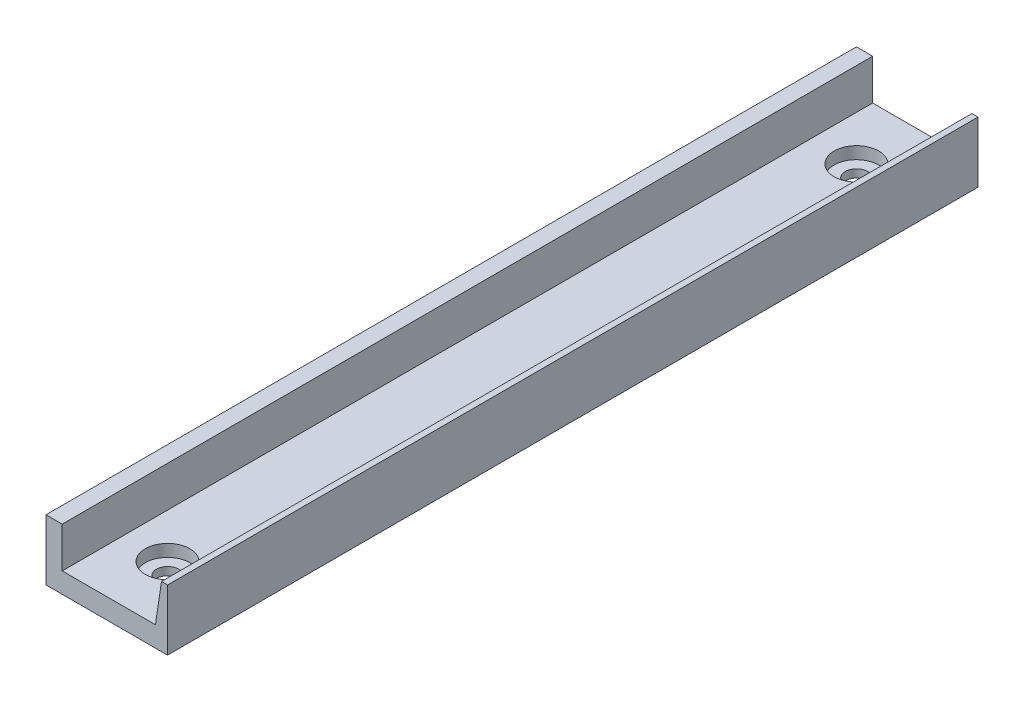
ISO-10303-21;
HEADER;
FILE_DESCRIPTION(('STEP AP214'),'2;1');
FILE_NAME('part.step','',(''),(''),'','','');
FILE_SCHEMA(('AUTOMOTIVE_DESIGN { 1 0 10303 214 1 1 1 1 }'));
ENDSEC;
DATA;
#1=APPLICATION_CONTEXT('core data for automotive mechanical design processes');
#2=APPLICATION_PROTOCOL_DEFINITION('international standard','automotive_design',2000,#1);
#3=PRODUCT_CONTEXT('',#1,'mechanical');
#4=PRODUCT('Part','Part','',(#3));
#5=PRODUCT_RELATED_PRODUCT_CATEGORY('part','',(#4));
#6=PRODUCT_DEFINITION_FORMATION('','',#4);
#7=PRODUCT_DEFINITION_CONTEXT('part definition',#1,'design');
#8=PRODUCT_DEFINITION('design','',#6,#7);
#9=PRODUCT_DEFINITION_SHAPE('','',#8);
#10=(LENGTH_UNIT() NAMED_UNIT(*) SI_UNIT(.MILLI.,.METRE.));
#11=(NAMED_UNIT(*) PLANE_ANGLE_UNIT() SI_UNIT($,.RADIAN.));
#12=(NAMED_UNIT(*) SI_UNIT($,.STERADIAN.) SOLID_ANGLE_UNIT());
#13=UNCERTAINTY_MEASURE_WITH_UNIT(LENGTH_MEASURE(1.E-05),#10,'distance_accuracy_value','');
#14=(GEOMETRIC_REPRESENTATION_CONTEXT(3) GLOBAL_UNCERTAINTY_ASSIGNED_CONTEXT((#13)) GLOBAL_UNIT_ASSIGNED_CONTEXT((#10,
#11,#12)) REPRESENTATION_CONTEXT('',''));
#15=CARTESIAN_POINT('',(0.,0.,0.));
#16=DIRECTION('',(0.,0.,1.));
#17=DIRECTION('',(1.,0.,0.));
#18=AXIS2_PLACEMENT_3D('',#15,#16,#17);
#19=CARTESIAN_POINT('',(0.,0.,0.));
#20=DIRECTION('',(0.,1.,0.));
#21=DIRECTION('',(0.,0.,1.));
#22=AXIS2_PLACEMENT_3D('',#19,#20,#21);
#23=PLANE('',#22);
#24=DIRECTION('',(0.,0.,-1.));
#25=VECTOR('',#24,1.);
#26=CARTESIAN_POINT('',(15.,0.,-100.));
#27=LINE('',#26,#25);
#28=CARTESIAN_POINT('',(15.,0.,100.));
#29=VERTEX_POINT('',#28);
#30=CARTESIAN_POINT('',(15.,0.,-100.));
#31=VERTEX_POINT('',#30);
#32=EDGE_CURVE('E242',#29,#31,#27,.T.);
#33=ORIENTED_EDGE('',*,*,#32,.F.);
#34=DIRECTION('',(1.,0.,0.));
#35=VECTOR('',#34,1.);
#36=CARTESIAN_POINT('',(-15.,0.,100.));
#37=LINE('',#36,#35);
#38=CARTESIAN_POINT('',(-15.,0.,100.));
#39=VERTEX_POINT('',#38);
#40=EDGE_CURVE('E247',#39,#29,#37,.T.);
#41=ORIENTED_EDGE('',*,*,#40,.F.);
#42=DIRECTION('',(0.,0.,1.));
#43=VECTOR('',#42,1.);
#44=CARTESIAN_POINT('',(-15.,0.,-100.));
#45=LINE('',#44,#43);
#46=CARTESIAN_POINT('',(-15.,0.,-100.));
#47=VERTEX_POINT('',#46);
#48=EDGE_CURVE('E258',#47,#39,#45,.T.);
#49=ORIENTED_EDGE('',*,*,#48,.F.);
#50=DIRECTION('',(-1.,0.,0.));
#51=VECTOR('',#50,1.);
#52=CARTESIAN_POINT('',(-15.,0.,-100.));
#53=LINE('',#52,#51);
#54=EDGE_CURVE('E255',#31,#47,#53,.T.);
#55=ORIENTED_EDGE('',*,*,#54,.F.);
#56=EDGE_LOOP('',(#33,#41,#49,#55));
#57=FACE_BOUND('',#56,.T.);
#58=CARTESIAN_POINT('',(0.,0.,85.));
#59=DIRECTION('',(0.,1.,0.));
#60=DIRECTION('',(0.,0.,1.));
#61=AXIS2_PLACEMENT_3D('',#58,#59,#60);
#62=CIRCLE('',#61,2.74999999999999);
#63=CARTESIAN_POINT('',(0.,0.,87.75));
#64=VERTEX_POINT('',#63);
#65=EDGE_CURVE('E190',#64,#64,#62,.T.);
#66=ORIENTED_EDGE('',*,*,#65,.T.);
#67=EDGE_LOOP('',(#66));
#68=FACE_BOUND('',#67,.T.);
#69=CARTESIAN_POINT('',(0.,0.,-85.));
#70=DIRECTION('',(0.,1.,0.));
#71=DIRECTION('',(0.,0.,1.));
#72=AXIS2_PLACEMENT_3D('',#69,#70,#71);
#73=CIRCLE('',#72,2.74999999999999);
#74=CARTESIAN_POINT('',(0.,0.,-82.25));
#75=VERTEX_POINT('',#74);
#76=EDGE_CURVE('E48',#75,#75,#73,.T.);
#77=ORIENTED_EDGE('',*,*,#76,.T.);
#78=EDGE_LOOP('',(#77));
#79=FACE_BOUND('',#78,.T.);
#80=DIRECTION('',(0.,0.,1.));
#81=VECTOR('',#80,1.);
#82=CARTESIAN_POINT('',(3.04999999999999,0.,60.));
#83=LINE('',#82,#81);
#84=CARTESIAN_POINT('',(3.05000000000001,0.,-60.));
#85=VERTEX_POINT('',#84);
#86=CARTESIAN_POINT('',(3.04999999999999,0.,60.));
#87=VERTEX_POINT('',#86);
#88=EDGE_CURVE('E158',#85,#87,#83,.T.);
#89=ORIENTED_EDGE('',*,*,#88,.F.);
#90=DIRECTION('',(1.,0.,0.));
#91=VECTOR('',#90,1.);
#92=CARTESIAN_POINT('',(-3.04999999999999,0.,-60.));
#93=LINE('',#92,#91);
#94=CARTESIAN_POINT('',(-3.04999999999999,0.,-60.));
#95=VERTEX_POINT('',#94);
#96=EDGE_CURVE('E155',#95,#85,#93,.T.);
#97=ORIENTED_EDGE('',*,*,#96,.F.);
#98=DIRECTION('',(0.,0.,-1.));
#99=VECTOR('',#98,1.);
#100=CARTESIAN_POINT('',(-3.05000000000001,0.,60.));
#101=LINE('',#100,#99);
#102=CARTESIAN_POINT('',(-3.05000000000001,0.,60.));
#103=VERTEX_POINT('',#102);
#104=EDGE_CURVE('E67',#103,#95,#101,.T.);
#105=ORIENTED_EDGE('',*,*,#104,.F.);
#106=DIRECTION('',(-1.,0.,0.));
#107=VECTOR('',#106,1.);
#108=CARTESIAN_POINT('',(-3.05000000000001,0.,60.));
#109=LINE('',#108,#107);
#110=EDGE_CURVE('E62',#87,#103,#109,.T.);
#111=ORIENTED_EDGE('',*,*,#110,.F.);
#112=EDGE_LOOP('',(#89,#97,#105,#111));
#113=FACE_BOUND('',#112,.T.);
#114=ADVANCED_FACE('F44',(#57,#68,#79,#113),#23,.F.);
#115=CARTESIAN_POINT('',(0.,5.,0.));
#116=DIRECTION('',(0.,1.,0.));
#117=DIRECTION('',(0.,0.,1.));
#118=AXIS2_PLACEMENT_3D('',#115,#116,#117);
#119=PLANE('',#118);
#120=CARTESIAN_POINT('',(0.,5.,-85.));
#121=DIRECTION('',(0.,1.,0.));
#122=DIRECTION('',(0.,0.,1.));
#123=AXIS2_PLACEMENT_3D('',#120,#121,#122);
#124=CIRCLE('',#123,5.5);
#125=CARTESIAN_POINT('',(0.,5.,-79.5));
#126=VERTEX_POINT('',#125);
#127=EDGE_CURVE('E160',#126,#126,#124,.T.);
#128=ORIENTED_EDGE('',*,*,#127,.F.);
#129=EDGE_LOOP('',(#128));
#130=FACE_BOUND('',#129,.T.);
#131=CARTESIAN_POINT('',(0.,5.,85.));
#132=DIRECTION('',(0.,1.,0.));
#133=DIRECTION('',(0.,0.,1.));
#134=AXIS2_PLACEMENT_3D('',#131,#132,#133);
#135=CIRCLE('',#134,5.5);
#136=CARTESIAN_POINT('',(0.,5.,90.5));
#137=VERTEX_POINT('',#136);
#138=EDGE_CURVE('E178',#137,#137,#135,.T.);
#139=ORIENTED_EDGE('',*,*,#138,.F.);
#140=EDGE_LOOP('',(#139));
#141=FACE_BOUND('',#140,.T.);
#142=DIRECTION('',(1.,0.,0.));
#143=VECTOR('',#142,1.);
#144=CARTESIAN_POINT('',(-15.,5.,100.));
#145=LINE('',#144,#143);
#146=CARTESIAN_POINT('',(-11.,5.,100.));
#147=VERTEX_POINT('',#146);
#148=CARTESIAN_POINT('',(12.,5.,100.));
#149=VERTEX_POINT('',#148);
#150=EDGE_CURVE('E246',#147,#149,#145,.T.);
#151=ORIENTED_EDGE('',*,*,#150,.T.);
#152=DIRECTION('',(0.,0.,1.));
#153=VECTOR('',#152,1.);
#154=CARTESIAN_POINT('',(12.,5.,-100.));
#155=LINE('',#154,#153);
#156=CARTESIAN_POINT('',(12.,5.,-100.));
#157=VERTEX_POINT('',#156);
#158=EDGE_CURVE('E203',#157,#149,#155,.T.);
#159=ORIENTED_EDGE('',*,*,#158,.F.);
#160=DIRECTION('',(-1.,0.,0.));
#161=VECTOR('',#160,1.);
#162=CARTESIAN_POINT('',(-15.,5.,-100.));
#163=LINE('',#162,#161);
#164=CARTESIAN_POINT('',(-11.,5.,-100.));
#165=VERTEX_POINT('',#164);
#166=EDGE_CURVE('E243',#157,#165,#163,.T.);
#167=ORIENTED_EDGE('',*,*,#166,.T.);
#168=DIRECTION('',(0.,0.,-1.));
#169=VECTOR('',#168,1.);
#170=CARTESIAN_POINT('',(-11.,5.,-100.));
#171=LINE('',#170,#169);
#172=EDGE_CURVE('E206',#147,#165,#171,.T.);
#173=ORIENTED_EDGE('',*,*,#172,.F.);
#174=EDGE_LOOP('',(#151,#159,#167,#173));
#175=FACE_BOUND('',#174,.T.);
#176=ADVANCED_FACE('F295',(#130,#141,#175),#119,.T.);
#177=CARTESIAN_POINT('',(15.,5.,-100.));
#178=DIRECTION('',(-1.,0.,0.));
#179=DIRECTION('',(0.,0.,1.));
#180=AXIS2_PLACEMENT_3D('',#177,#178,#179);
#181=PLANE('',#180);
#182=ORIENTED_EDGE('',*,*,#32,.T.);
#183=DIRECTION('',(0.,-1.,0.));
#184=VECTOR('',#183,1.);
#185=CARTESIAN_POINT('',(15.,5.,-100.));
#186=LINE('',#185,#184);
#187=CARTESIAN_POINT('',(15.,15.,-100.));
#188=VERTEX_POINT('',#187);
#189=EDGE_CURVE('E11',#188,#31,#186,.T.);
#190=ORIENTED_EDGE('',*,*,#189,.F.);
#191=DIRECTION('',(0.,0.,-1.));
#192=VECTOR('',#191,1.);
#193=CARTESIAN_POINT('',(15.,15.,-100.));
#194=LINE('',#193,#192);
#195=CARTESIAN_POINT('',(15.,15.,100.));
#196=VERTEX_POINT('',#195);
#197=EDGE_CURVE('E207',#196,#188,#194,.T.);
#198=ORIENTED_EDGE('',*,*,#197,.F.);
#199=DIRECTION('',(0.,-1.,0.));
#200=VECTOR('',#199,1.);
#201=CARTESIAN_POINT('',(15.,5.,100.));
#202=LINE('',#201,#200);
#203=EDGE_CURVE('E251',#196,#29,#202,.T.);
#204=ORIENTED_EDGE('',*,*,#203,.T.);
#205=EDGE_LOOP('',(#182,#190,#198,#204));
#206=FACE_BOUND('',#205,.T.);
#207=ADVANCED_FACE('F46',(#206),#181,.F.);
#208=CARTESIAN_POINT('',(-15.,5.,-100.));
#209=DIRECTION('',(0.,0.,1.));
#210=DIRECTION('',(1.,0.,0.));
#211=AXIS2_PLACEMENT_3D('',#208,#209,#210);
#212=PLANE('',#211);
#213=ORIENTED_EDGE('',*,*,#166,.F.);
#214=DIRECTION('',(0.148340452930243,0.988936352868298,0.));
#215=VECTOR('',#214,1.);
#216=CARTESIAN_POINT('',(13.5,15.,-100.));
#217=LINE('',#216,#215);
#218=CARTESIAN_POINT('',(13.5,15.,-100.));
#219=VERTEX_POINT('',#218);
#220=EDGE_CURVE('E191',#157,#219,#217,.T.);
#221=ORIENTED_EDGE('',*,*,#220,.T.);
#222=DIRECTION('',(-1.,0.,0.));
#223=VECTOR('',#222,1.);
#224=CARTESIAN_POINT('',(15.,15.,-100.));
#225=LINE('',#224,#223);
#226=EDGE_CURVE('E210',#188,#219,#225,.T.);
#227=ORIENTED_EDGE('',*,*,#226,.F.);
#228=ORIENTED_EDGE('',*,*,#189,.T.);
#229=ORIENTED_EDGE('',*,*,#54,.T.);
#230=DIRECTION('',(0.,-1.,0.));
#231=VECTOR('',#230,1.);
#232=CARTESIAN_POINT('',(-15.,5.,-100.));
#233=LINE('',#232,#231);
#234=CARTESIAN_POINT('',(-15.,15.,-100.));
#235=VERTEX_POINT('',#234);
#236=EDGE_CURVE('E54',#235,#47,#233,.T.);
#237=ORIENTED_EDGE('',*,*,#236,.F.);
#238=DIRECTION('',(-1.,0.,0.));
#239=VECTOR('',#238,1.);
#240=CARTESIAN_POINT('',(-15.,15.,-100.));
#241=LINE('',#240,#239);
#242=CARTESIAN_POINT('',(-11.,15.,-100.));
#243=VERTEX_POINT('',#242);
#244=EDGE_CURVE('E227',#243,#235,#241,.T.);
#245=ORIENTED_EDGE('',*,*,#244,.F.);
#246=DIRECTION('',(0.,-1.,0.));
#247=VECTOR('',#246,1.);
#248=CARTESIAN_POINT('',(-11.,15.,-100.));
#249=LINE('',#248,#247);
#250=EDGE_CURVE('E231',#243,#165,#249,.T.);
#251=ORIENTED_EDGE('',*,*,#250,.T.);
#252=EDGE_LOOP('',(#213,#221,#227,#228,#229,#237,#245,#251));
#253=FACE_BOUND('',#252,.T.);
#254=ADVANCED_FACE('F313',(#253),#212,.F.);
#255=CARTESIAN_POINT('',(-15.,5.,-100.));
#256=DIRECTION('',(1.,0.,0.));
#257=DIRECTION('',(0.,0.,-1.));
#258=AXIS2_PLACEMENT_3D('',#255,#256,#257);
#259=PLANE('',#258);
#260=ORIENTED_EDGE('',*,*,#48,.T.);
#261=DIRECTION('',(0.,-1.,0.));
#262=VECTOR('',#261,1.);
#263=CARTESIAN_POINT('',(-15.,5.,100.));
#264=LINE('',#263,#262);
#265=CARTESIAN_POINT('',(-15.,15.,100.));
#266=VERTEX_POINT('',#265);
#267=EDGE_CURVE('E266',#266,#39,#264,.T.);
#268=ORIENTED_EDGE('',*,*,#267,.F.);
#269=DIRECTION('',(0.,0.,1.));
#270=VECTOR('',#269,1.);
#271=CARTESIAN_POINT('',(-15.,15.,-100.));
#272=LINE('',#271,#270);
#273=EDGE_CURVE('E217',#235,#266,#272,.T.);
#274=ORIENTED_EDGE('',*,*,#273,.F.);
#275=ORIENTED_EDGE('',*,*,#236,.T.);
#276=EDGE_LOOP('',(#260,#268,#274,#275));
#277=FACE_BOUND('',#276,.T.);
#278=ADVANCED_FACE('F310',(#277),#259,.F.);
#279=CARTESIAN_POINT('',(-15.,5.,100.));
#280=DIRECTION('',(0.,0.,-1.));
#281=DIRECTION('',(-1.,0.,0.));
#282=AXIS2_PLACEMENT_3D('',#279,#280,#281);
#283=PLANE('',#282);
#284=DIRECTION('',(1.,0.,0.));
#285=VECTOR('',#284,1.);
#286=CARTESIAN_POINT('',(15.,15.,100.));
#287=LINE('',#286,#285);
#288=CARTESIAN_POINT('',(13.5,15.,100.));
#289=VERTEX_POINT('',#288);
#290=EDGE_CURVE('E202',#289,#196,#287,.T.);
#291=ORIENTED_EDGE('',*,*,#290,.F.);
#292=DIRECTION('',(0.148340452930243,0.988936352868298,0.));
#293=VECTOR('',#292,1.);
#294=CARTESIAN_POINT('',(13.5,15.,100.));
#295=LINE('',#294,#293);
#296=EDGE_CURVE('E196',#149,#289,#295,.T.);
#297=ORIENTED_EDGE('',*,*,#296,.F.);
#298=ORIENTED_EDGE('',*,*,#150,.F.);
#299=DIRECTION('',(0.,-1.,0.));
#300=VECTOR('',#299,1.);
#301=CARTESIAN_POINT('',(-11.,15.,100.));
#302=LINE('',#301,#300);
#303=CARTESIAN_POINT('',(-11.,15.,100.));
#304=VERTEX_POINT('',#303);
#305=EDGE_CURVE('E238',#304,#147,#302,.T.);
#306=ORIENTED_EDGE('',*,*,#305,.F.);
#307=DIRECTION('',(1.,0.,0.));
#308=VECTOR('',#307,1.);
#309=CARTESIAN_POINT('',(-15.,15.,100.));
#310=LINE('',#309,#308);
#311=EDGE_CURVE('E221',#266,#304,#310,.T.);
#312=ORIENTED_EDGE('',*,*,#311,.F.);
#313=ORIENTED_EDGE('',*,*,#267,.T.);
#314=ORIENTED_EDGE('',*,*,#40,.T.);
#315=ORIENTED_EDGE('',*,*,#203,.F.);
#316=EDGE_LOOP('',(#291,#297,#298,#306,#312,#313,#314,#315));
#317=FACE_BOUND('',#316,.T.);
#318=ADVANCED_FACE('F306',(#317),#283,.F.);
#319=CARTESIAN_POINT('',(-11.,15.,-100.));
#320=DIRECTION('',(-1.,0.,0.));
#321=DIRECTION('',(0.,0.,1.));
#322=AXIS2_PLACEMENT_3D('',#319,#320,#321);
#323=PLANE('',#322);
#324=ORIENTED_EDGE('',*,*,#172,.T.);
#325=ORIENTED_EDGE('',*,*,#250,.F.);
#326=DIRECTION('',(0.,0.,-1.));
#327=VECTOR('',#326,1.);
#328=CARTESIAN_POINT('',(-11.,15.,-100.));
#329=LINE('',#328,#327);
#330=EDGE_CURVE('E224',#304,#243,#329,.T.);
#331=ORIENTED_EDGE('',*,*,#330,.F.);
#332=ORIENTED_EDGE('',*,*,#305,.T.);
#333=EDGE_LOOP('',(#324,#325,#331,#332));
#334=FACE_BOUND('',#333,.T.);
#335=ADVANCED_FACE('F309',(#334),#323,.F.);
#336=CARTESIAN_POINT('',(0.,15.,0.));
#337=DIRECTION('',(0.,1.,0.));
#338=DIRECTION('',(0.,0.,1.));
#339=AXIS2_PLACEMENT_3D('',#336,#337,#338);
#340=PLANE('',#339);
#341=ORIENTED_EDGE('',*,*,#273,.T.);
#342=ORIENTED_EDGE('',*,*,#311,.T.);
#343=ORIENTED_EDGE('',*,*,#330,.T.);
#344=ORIENTED_EDGE('',*,*,#244,.T.);
#345=EDGE_LOOP('',(#341,#342,#343,#344));
#346=FACE_BOUND('',#345,.T.);
#347=ADVANCED_FACE('F341',(#346),#340,.T.);
#348=CARTESIAN_POINT('',(0.,15.,0.));
#349=DIRECTION('',(0.,-1.,0.));
#350=DIRECTION('',(0.,0.,-1.));
#351=AXIS2_PLACEMENT_3D('',#348,#349,#350);
#352=PLANE('',#351);
#353=ORIENTED_EDGE('',*,*,#226,.T.);
#354=DIRECTION('',(0.,0.,1.));
#355=VECTOR('',#354,1.);
#356=CARTESIAN_POINT('',(13.5,15.,-100.));
#357=LINE('',#356,#355);
#358=EDGE_CURVE('E195',#219,#289,#357,.T.);
#359=ORIENTED_EDGE('',*,*,#358,.T.);
#360=ORIENTED_EDGE('',*,*,#290,.T.);
#361=ORIENTED_EDGE('',*,*,#197,.T.);
#362=EDGE_LOOP('',(#353,#359,#360,#361));
#363=FACE_BOUND('',#362,.T.);
#364=ADVANCED_FACE('F291',(#363),#352,.F.);
#365=CARTESIAN_POINT('',(13.5,15.,-100.));
#366=DIRECTION('',(0.988936352868298,-0.148340452930243,0.));
#367=DIRECTION('',(0.148340452930243,0.988936352868298,0.));
#368=AXIS2_PLACEMENT_3D('',#365,#366,#367);
#369=PLANE('',#368);
#370=ORIENTED_EDGE('',*,*,#296,.T.);
#371=ORIENTED_EDGE('',*,*,#358,.F.);
#372=ORIENTED_EDGE('',*,*,#220,.F.);
#373=ORIENTED_EDGE('',*,*,#158,.T.);
#374=EDGE_LOOP('',(#370,#371,#372,#373));
#375=FACE_BOUND('',#374,.T.);
#376=ADVANCED_FACE('F281',(#375),#369,.F.);
#377=CARTESIAN_POINT('',(0.,5.,85.));
#378=DIRECTION('',(0.,1.,0.));
#379=DIRECTION('',(0.,0.,1.));
#380=AXIS2_PLACEMENT_3D('',#377,#378,#379);
#381=CYLINDRICAL_SURFACE('',#380,2.74999999999999);
#382=CARTESIAN_POINT('',(0.,2.,85.));
#383=DIRECTION('',(0.,1.,0.));
#384=DIRECTION('',(0.,0.,1.));
#385=AXIS2_PLACEMENT_3D('',#382,#383,#384);
#386=CIRCLE('',#385,2.75);
#387=CARTESIAN_POINT('',(0.,2.,87.75));
#388=VERTEX_POINT('',#387);
#389=EDGE_CURVE('E186',#388,#388,#386,.T.);
#390=ORIENTED_EDGE('',*,*,#389,.T.);
#391=EDGE_LOOP('',(#390));
#392=FACE_BOUND('',#391,.T.);
#393=ORIENTED_EDGE('',*,*,#65,.F.);
#394=EDGE_LOOP('',(#393));
#395=FACE_BOUND('',#394,.T.);
#396=ADVANCED_FACE('F278',(#392,#395),#381,.F.);
#397=CARTESIAN_POINT('',(2.74999999999998,2.,85.));
#398=DIRECTION('',(0.,-1.,0.));
#399=DIRECTION('',(0.,0.,-1.));
#400=AXIS2_PLACEMENT_3D('',#397,#398,#399);
#401=PLANE('',#400);
#402=ORIENTED_EDGE('',*,*,#389,.F.);
#403=EDGE_LOOP('',(#402));
#404=FACE_BOUND('',#403,.T.);
#405=CARTESIAN_POINT('',(0.,2.,85.));
#406=DIRECTION('',(0.,1.,0.));
#407=DIRECTION('',(0.,0.,1.));
#408=AXIS2_PLACEMENT_3D('',#405,#406,#407);
#409=CIRCLE('',#408,5.5);
#410=CARTESIAN_POINT('',(0.,2.,90.5));
#411=VERTEX_POINT('',#410);
#412=EDGE_CURVE('E182',#411,#411,#409,.T.);
#413=ORIENTED_EDGE('',*,*,#412,.T.);
#414=EDGE_LOOP('',(#413));
#415=FACE_BOUND('',#414,.T.);
#416=ADVANCED_FACE('F280',(#404,#415),#401,.F.);
#417=CARTESIAN_POINT('',(0.,5.,85.));
#418=DIRECTION('',(0.,1.,0.));
#419=DIRECTION('',(0.,0.,1.));
#420=AXIS2_PLACEMENT_3D('',#417,#418,#419);
#421=CYLINDRICAL_SURFACE('',#420,5.5);
#422=ORIENTED_EDGE('',*,*,#412,.F.);
#423=EDGE_LOOP('',(#422));
#424=FACE_BOUND('',#423,.T.);
#425=ORIENTED_EDGE('',*,*,#138,.T.);
#426=EDGE_LOOP('',(#425));
#427=FACE_BOUND('',#426,.T.);
#428=ADVANCED_FACE('F288',(#424,#427),#421,.F.);
#429=CARTESIAN_POINT('',(0.,5.,-85.));
#430=DIRECTION('',(0.,1.,0.));
#431=DIRECTION('',(0.,0.,1.));
#432=AXIS2_PLACEMENT_3D('',#429,#430,#431);
#433=CYLINDRICAL_SURFACE('',#432,2.74999999999999);
#434=CARTESIAN_POINT('',(0.,2.,-85.));
#435=DIRECTION('',(0.,1.,0.));
#436=DIRECTION('',(0.,0.,1.));
#437=AXIS2_PLACEMENT_3D('',#434,#435,#436);
#438=CIRCLE('',#437,2.75);
#439=CARTESIAN_POINT('',(0.,2.,-82.25));
#440=VERTEX_POINT('',#439);
#441=EDGE_CURVE('E174',#440,#440,#438,.T.);
#442=ORIENTED_EDGE('',*,*,#441,.T.);
#443=EDGE_LOOP('',(#442));
#444=FACE_BOUND('',#443,.T.);
#445=ORIENTED_EDGE('',*,*,#76,.F.);
#446=EDGE_LOOP('',(#445));
#447=FACE_BOUND('',#446,.T.);
#448=ADVANCED_FACE('F403',(#444,#447),#433,.F.);
#449=CARTESIAN_POINT('',(2.74999999999998,2.,-85.));
#450=DIRECTION('',(0.,-1.,0.));
#451=DIRECTION('',(0.,0.,-1.));
#452=AXIS2_PLACEMENT_3D('',#449,#450,#451);
#453=PLANE('',#452);
#454=ORIENTED_EDGE('',*,*,#441,.F.);
#455=EDGE_LOOP('',(#454));
#456=FACE_BOUND('',#455,.T.);
#457=CARTESIAN_POINT('',(0.,2.,-85.));
#458=DIRECTION('',(0.,1.,0.));
#459=DIRECTION('',(0.,0.,1.));
#460=AXIS2_PLACEMENT_3D('',#457,#458,#459);
#461=CIRCLE('',#460,5.5);
#462=CARTESIAN_POINT('',(0.,2.,-79.5));
#463=VERTEX_POINT('',#462);
#464=EDGE_CURVE('E165',#463,#463,#461,.T.);
#465=ORIENTED_EDGE('',*,*,#464,.T.);
#466=EDGE_LOOP('',(#465));
#467=FACE_BOUND('',#466,.T.);
#468=ADVANCED_FACE('F414',(#456,#467),#453,.F.);
#469=CARTESIAN_POINT('',(0.,5.,-85.));
#470=DIRECTION('',(0.,1.,0.));
#471=DIRECTION('',(0.,0.,1.));
#472=AXIS2_PLACEMENT_3D('',#469,#470,#471);
#473=CYLINDRICAL_SURFACE('',#472,5.5);
#474=ORIENTED_EDGE('',*,*,#464,.F.);
#475=EDGE_LOOP('',(#474));
#476=FACE_BOUND('',#475,.T.);
#477=ORIENTED_EDGE('',*,*,#127,.T.);
#478=EDGE_LOOP('',(#477));
#479=FACE_BOUND('',#478,.T.);
#480=ADVANCED_FACE('F425',(#476,#479),#473,.F.);
#481=CARTESIAN_POINT('',(3.04999999999999,-6.,60.));
#482=DIRECTION('',(-1.,0.,0.));
#483=DIRECTION('',(0.,0.,1.));
#484=AXIS2_PLACEMENT_3D('',#481,#482,#483);
#485=PLANE('',#484);
#486=ORIENTED_EDGE('',*,*,#88,.T.);
#487=DIRECTION('',(0.,1.,0.));
#488=VECTOR('',#487,1.);
#489=CARTESIAN_POINT('',(3.04999999999999,-6.,60.));
#490=LINE('',#489,#488);
#491=CARTESIAN_POINT('',(3.04999999999999,-6.,60.));
#492=VERTEX_POINT('',#491);
#493=EDGE_CURVE('E137',#492,#87,#490,.T.);
#494=ORIENTED_EDGE('',*,*,#493,.F.);
#495=DIRECTION('',(0.,0.,1.));
#496=VECTOR('',#495,1.);
#497=CARTESIAN_POINT('',(3.04999999999999,-6.,60.));
#498=LINE('',#497,#496);
#499=CARTESIAN_POINT('',(3.05000000000001,-6.,-60.));
#500=VERTEX_POINT('',#499);
#501=EDGE_CURVE('E145',#500,#492,#498,.T.);
#502=ORIENTED_EDGE('',*,*,#501,.F.);
#503=DIRECTION('',(0.,1.,0.));
#504=VECTOR('',#503,1.);
#505=CARTESIAN_POINT('',(3.05000000000001,-6.,-60.));
#506=LINE('',#505,#504);
#507=EDGE_CURVE('E501',#500,#85,#506,.T.);
#508=ORIENTED_EDGE('',*,*,#507,.T.);
#509=EDGE_LOOP('',(#486,#494,#502,#508));
#510=FACE_BOUND('',#509,.T.);
#511=ADVANCED_FACE('F157',(#510),#485,.F.);
#512=CARTESIAN_POINT('',(-3.05000000000001,-6.,60.));
#513=DIRECTION('',(0.,0.,-1.));
#514=DIRECTION('',(-1.,0.,0.));
#515=AXIS2_PLACEMENT_3D('',#512,#513,#514);
#516=PLANE('',#515);
#517=ORIENTED_EDGE('',*,*,#110,.T.);
#518=DIRECTION('',(0.,1.,0.));
#519=VECTOR('',#518,1.);
#520=CARTESIAN_POINT('',(-3.05000000000001,-6.,60.));
#521=LINE('',#520,#519);
#522=CARTESIAN_POINT('',(-3.05000000000001,-6.,60.));
#523=VERTEX_POINT('',#522);
#524=EDGE_CURVE('E140',#523,#103,#521,.T.);
#525=ORIENTED_EDGE('',*,*,#524,.F.);
#526=DIRECTION('',(-1.,0.,0.));
#527=VECTOR('',#526,1.);
#528=CARTESIAN_POINT('',(-3.05000000000001,-6.,60.));
#529=LINE('',#528,#527);
#530=EDGE_CURVE('E133',#492,#523,#529,.T.);
#531=ORIENTED_EDGE('',*,*,#530,.F.);
#532=ORIENTED_EDGE('',*,*,#493,.T.);
#533=EDGE_LOOP('',(#517,#525,#531,#532));
#534=FACE_BOUND('',#533,.T.);
#535=ADVANCED_FACE('F135',(#534),#516,.F.);
#536=CARTESIAN_POINT('',(-3.05000000000001,-6.,60.));
#537=DIRECTION('',(1.,0.,0.));
#538=DIRECTION('',(0.,0.,-1.));
#539=AXIS2_PLACEMENT_3D('',#536,#537,#538);
#540=PLANE('',#539);
#541=ORIENTED_EDGE('',*,*,#104,.T.);
#542=DIRECTION('',(0.,1.,0.));
#543=VECTOR('',#542,1.);
#544=CARTESIAN_POINT('',(-3.04999999999999,-6.,-60.));
#545=LINE('',#544,#543);
#546=CARTESIAN_POINT('',(-3.04999999999999,-6.,-60.));
#547=VERTEX_POINT('',#546);
#548=EDGE_CURVE('E167',#547,#95,#545,.T.);
#549=ORIENTED_EDGE('',*,*,#548,.F.);
#550=DIRECTION('',(0.,0.,-1.));
#551=VECTOR('',#550,1.);
#552=CARTESIAN_POINT('',(-3.05000000000001,-6.,60.));
#553=LINE('',#552,#551);
#554=EDGE_CURVE('E144',#523,#547,#553,.T.);
#555=ORIENTED_EDGE('',*,*,#554,.F.);
#556=ORIENTED_EDGE('',*,*,#524,.T.);
#557=EDGE_LOOP('',(#541,#549,#555,#556));
#558=FACE_BOUND('',#557,.T.);
#559=ADVANCED_FACE('F459',(#558),#540,.F.);
#560=CARTESIAN_POINT('',(-3.04999999999999,-6.,-60.));
#561=DIRECTION('',(0.,0.,1.));
#562=DIRECTION('',(1.,0.,0.));
#563=AXIS2_PLACEMENT_3D('',#560,#561,#562);
#564=PLANE('',#563);
#565=ORIENTED_EDGE('',*,*,#96,.T.);
#566=ORIENTED_EDGE('',*,*,#507,.F.);
#567=DIRECTION('',(1.,0.,0.));
#568=VECTOR('',#567,1.);
#569=CARTESIAN_POINT('',(-3.04999999999999,-6.,-60.));
#570=LINE('',#569,#568);
#571=EDGE_CURVE('E150',#547,#500,#570,.T.);
#572=ORIENTED_EDGE('',*,*,#571,.F.);
#573=ORIENTED_EDGE('',*,*,#548,.T.);
#574=EDGE_LOOP('',(#565,#566,#572,#573));
#575=FACE_BOUND('',#574,.T.);
#576=ADVANCED_FACE('F469',(#575),#564,.F.);
#577=CARTESIAN_POINT('',(0.,-6.,0.));
#578=DIRECTION('',(0.,-1.,0.));
#579=DIRECTION('',(0.,0.,-1.));
#580=AXIS2_PLACEMENT_3D('',#577,#578,#579);
#581=PLANE('',#580);
#582=ORIENTED_EDGE('',*,*,#501,.T.);
#583=ORIENTED_EDGE('',*,*,#530,.T.);
#584=ORIENTED_EDGE('',*,*,#554,.T.);
#585=ORIENTED_EDGE('',*,*,#571,.T.);
#586=EDGE_LOOP('',(#582,#583,#584,#585));
#587=FACE_BOUND('',#586,.T.);
#588=ADVANCED_FACE('F148',(#587),#581,.T.);
#589=CLOSED_SHELL('',(#114,#176,#207,#254,#278,#318,#335,#347,#364,#376,#396,#416,#428,#448,
#468,#480,#511,#535,#559,#576,#588));
#590=MANIFOLD_SOLID_BREP('B2',#589);
#591=ADVANCED_BREP_SHAPE_REPRESENTATION('',(#18,#590),#14);
#592=SHAPE_DEFINITION_REPRESENTATION(#9,#591);
ENDSEC;
END-ISO-10303-21;
